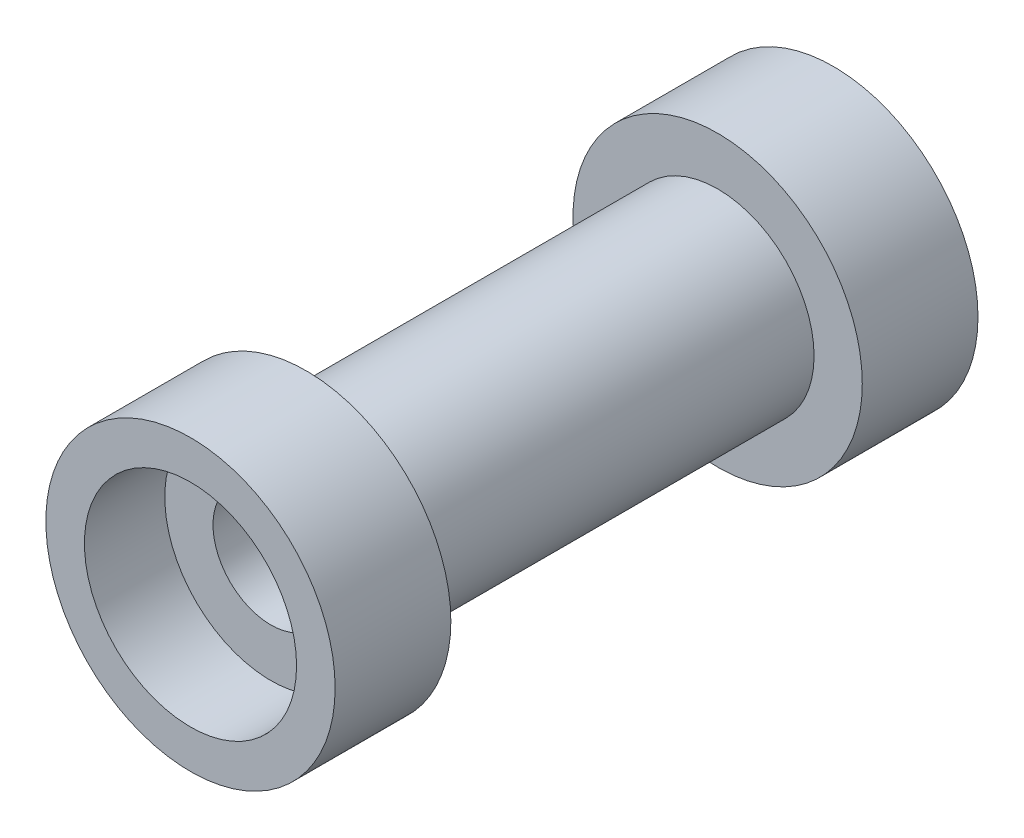
ISO-10303-21;
HEADER;
FILE_DESCRIPTION(('STEP AP214'),'2;1');
FILE_NAME('part.step','',(''),(''),'','','');
FILE_SCHEMA(('AUTOMOTIVE_DESIGN { 1 0 10303 214 1 1 1 1 }'));
ENDSEC;
DATA;
#1=APPLICATION_CONTEXT('core data for automotive mechanical design processes');
#2=APPLICATION_PROTOCOL_DEFINITION('international standard','automotive_design',2000,#1);
#3=PRODUCT_CONTEXT('',#1,'mechanical');
#4=PRODUCT('Part','Part','',(#3));
#5=PRODUCT_RELATED_PRODUCT_CATEGORY('part','',(#4));
#6=PRODUCT_DEFINITION_FORMATION('','',#4);
#7=PRODUCT_DEFINITION_CONTEXT('part definition',#1,'design');
#8=PRODUCT_DEFINITION('design','',#6,#7);
#9=PRODUCT_DEFINITION_SHAPE('','',#8);
#10=(LENGTH_UNIT() NAMED_UNIT(*) SI_UNIT(.MILLI.,.METRE.));
#11=(NAMED_UNIT(*) PLANE_ANGLE_UNIT() SI_UNIT($,.RADIAN.));
#12=(NAMED_UNIT(*) SI_UNIT($,.STERADIAN.) SOLID_ANGLE_UNIT());
#13=UNCERTAINTY_MEASURE_WITH_UNIT(LENGTH_MEASURE(1.E-05),#10,'distance_accuracy_value','');
#14=(GEOMETRIC_REPRESENTATION_CONTEXT(3) GLOBAL_UNCERTAINTY_ASSIGNED_CONTEXT((#13)) GLOBAL_UNIT_ASSIGNED_CONTEXT((#10,
#11,#12)) REPRESENTATION_CONTEXT('',''));
#15=CARTESIAN_POINT('',(0.,0.,0.));
#16=DIRECTION('',(0.,0.,1.));
#17=DIRECTION('',(1.,0.,0.));
#18=AXIS2_PLACEMENT_3D('',#15,#16,#17);
#19=CARTESIAN_POINT('',(-6.,0.,-12.8));
#20=DIRECTION('',(0.,0.,-1.));
#21=DIRECTION('',(-1.,0.,0.));
#22=AXIS2_PLACEMENT_3D('',#19,#20,#21);
#23=PLANE('',#22);
#24=CARTESIAN_POINT('',(0.,0.,-12.8));
#25=DIRECTION('',(0.,0.,1.));
#26=DIRECTION('',(1.,0.,0.));
#27=AXIS2_PLACEMENT_3D('',#24,#25,#26);
#28=CIRCLE('',#27,6.);
#29=CARTESIAN_POINT('',(6.,0.,-12.8));
#30=VERTEX_POINT('',#29);
#31=EDGE_CURVE('E77',#30,#30,#28,.T.);
#32=ORIENTED_EDGE('',*,*,#31,.F.);
#33=EDGE_LOOP('',(#32));
#34=FACE_BOUND('',#33,.T.);
#35=CARTESIAN_POINT('',(0.,0.,-12.8));
#36=DIRECTION('',(0.,0.,1.));
#37=DIRECTION('',(1.,0.,0.));
#38=AXIS2_PLACEMENT_3D('',#35,#36,#37);
#39=CIRCLE('',#38,9.);
#40=CARTESIAN_POINT('',(9.,0.,-12.8));
#41=VERTEX_POINT('',#40);
#42=EDGE_CURVE('E10',#41,#41,#39,.T.);
#43=ORIENTED_EDGE('',*,*,#42,.T.);
#44=EDGE_LOOP('',(#43));
#45=FACE_BOUND('',#44,.T.);
#46=ADVANCED_FACE('F37',(#34,#45),#23,.F.);
#47=CARTESIAN_POINT('',(0.,0.,0.));
#48=DIRECTION('',(0.,0.,1.));
#49=DIRECTION('',(1.,0.,0.));
#50=AXIS2_PLACEMENT_3D('',#47,#48,#49);
#51=CYLINDRICAL_SURFACE('',#50,9.);
#52=ORIENTED_EDGE('',*,*,#42,.F.);
#53=EDGE_LOOP('',(#52));
#54=FACE_BOUND('',#53,.T.);
#55=CARTESIAN_POINT('',(0.,0.,-20.));
#56=DIRECTION('',(0.,0.,1.));
#57=DIRECTION('',(1.,0.,0.));
#58=AXIS2_PLACEMENT_3D('',#55,#56,#57);
#59=CIRCLE('',#58,9.);
#60=CARTESIAN_POINT('',(9.,0.,-20.));
#61=VERTEX_POINT('',#60);
#62=EDGE_CURVE('E43',#61,#61,#59,.T.);
#63=ORIENTED_EDGE('',*,*,#62,.T.);
#64=EDGE_LOOP('',(#63));
#65=FACE_BOUND('',#64,.T.);
#66=ADVANCED_FACE('F84',(#54,#65),#51,.T.);
#67=CARTESIAN_POINT('',(-9.,0.,-20.));
#68=DIRECTION('',(0.,0.,1.));
#69=DIRECTION('',(1.,0.,0.));
#70=AXIS2_PLACEMENT_3D('',#67,#68,#69);
#71=PLANE('',#70);
#72=ORIENTED_EDGE('',*,*,#62,.F.);
#73=EDGE_LOOP('',(#72));
#74=FACE_BOUND('',#73,.T.);
#75=CARTESIAN_POINT('',(0.,0.,-20.));
#76=DIRECTION('',(0.,0.,1.));
#77=DIRECTION('',(1.,0.,0.));
#78=AXIS2_PLACEMENT_3D('',#75,#76,#77);
#79=CIRCLE('',#78,6.6);
#80=CARTESIAN_POINT('',(6.6,0.,-20.));
#81=VERTEX_POINT('',#80);
#82=EDGE_CURVE('E47',#81,#81,#79,.T.);
#83=ORIENTED_EDGE('',*,*,#82,.T.);
#84=EDGE_LOOP('',(#83));
#85=FACE_BOUND('',#84,.T.);
#86=ADVANCED_FACE('F88',(#74,#85),#71,.F.);
#87=CARTESIAN_POINT('',(0.,0.,0.));
#88=DIRECTION('',(0.,0.,1.));
#89=DIRECTION('',(1.,0.,0.));
#90=AXIS2_PLACEMENT_3D('',#87,#88,#89);
#91=CYLINDRICAL_SURFACE('',#90,6.6);
#92=ORIENTED_EDGE('',*,*,#82,.F.);
#93=EDGE_LOOP('',(#92));
#94=FACE_BOUND('',#93,.T.);
#95=CARTESIAN_POINT('',(0.,0.,-15.));
#96=DIRECTION('',(0.,0.,1.));
#97=DIRECTION('',(1.,0.,0.));
#98=AXIS2_PLACEMENT_3D('',#95,#96,#97);
#99=CIRCLE('',#98,6.6);
#100=CARTESIAN_POINT('',(6.6,0.,-15.));
#101=VERTEX_POINT('',#100);
#102=EDGE_CURVE('E51',#101,#101,#99,.T.);
#103=ORIENTED_EDGE('',*,*,#102,.T.);
#104=EDGE_LOOP('',(#103));
#105=FACE_BOUND('',#104,.T.);
#106=ADVANCED_FACE('F93',(#94,#105),#91,.F.);
#107=CARTESIAN_POINT('',(-6.6,0.,-15.));
#108=DIRECTION('',(0.,0.,1.));
#109=DIRECTION('',(1.,0.,0.));
#110=AXIS2_PLACEMENT_3D('',#107,#108,#109);
#111=PLANE('',#110);
#112=ORIENTED_EDGE('',*,*,#102,.F.);
#113=EDGE_LOOP('',(#112));
#114=FACE_BOUND('',#113,.T.);
#115=CARTESIAN_POINT('',(0.,0.,-15.));
#116=DIRECTION('',(0.,0.,1.));
#117=DIRECTION('',(1.,0.,0.));
#118=AXIS2_PLACEMENT_3D('',#115,#116,#117);
#119=CIRCLE('',#118,3.6);
#120=CARTESIAN_POINT('',(3.6,0.,-15.));
#121=VERTEX_POINT('',#120);
#122=EDGE_CURVE('E56',#121,#121,#119,.T.);
#123=ORIENTED_EDGE('',*,*,#122,.T.);
#124=EDGE_LOOP('',(#123));
#125=FACE_BOUND('',#124,.T.);
#126=ADVANCED_FACE('F99',(#114,#125),#111,.F.);
#127=CARTESIAN_POINT('',(0.,0.,0.));
#128=DIRECTION('',(0.,0.,1.));
#129=DIRECTION('',(1.,0.,0.));
#130=AXIS2_PLACEMENT_3D('',#127,#128,#129);
#131=CYLINDRICAL_SURFACE('',#130,3.6);
#132=ORIENTED_EDGE('',*,*,#122,.F.);
#133=EDGE_LOOP('',(#132));
#134=FACE_BOUND('',#133,.T.);
#135=CARTESIAN_POINT('',(0.,0.,15.));
#136=DIRECTION('',(0.,0.,1.));
#137=DIRECTION('',(1.,0.,0.));
#138=AXIS2_PLACEMENT_3D('',#135,#136,#137);
#139=CIRCLE('',#138,3.6);
#140=CARTESIAN_POINT('',(3.6,0.,15.));
#141=VERTEX_POINT('',#140);
#142=EDGE_CURVE('E59',#141,#141,#139,.T.);
#143=ORIENTED_EDGE('',*,*,#142,.T.);
#144=EDGE_LOOP('',(#143));
#145=FACE_BOUND('',#144,.T.);
#146=ADVANCED_FACE('F103',(#134,#145),#131,.F.);
#147=CARTESIAN_POINT('',(-6.6,0.,15.));
#148=DIRECTION('',(0.,0.,-1.));
#149=DIRECTION('',(-1.,0.,0.));
#150=AXIS2_PLACEMENT_3D('',#147,#148,#149);
#151=PLANE('',#150);
#152=ORIENTED_EDGE('',*,*,#142,.F.);
#153=EDGE_LOOP('',(#152));
#154=FACE_BOUND('',#153,.T.);
#155=CARTESIAN_POINT('',(0.,0.,15.));
#156=DIRECTION('',(0.,0.,1.));
#157=DIRECTION('',(1.,0.,0.));
#158=AXIS2_PLACEMENT_3D('',#155,#156,#157);
#159=CIRCLE('',#158,6.6);
#160=CARTESIAN_POINT('',(6.6,0.,15.));
#161=VERTEX_POINT('',#160);
#162=EDGE_CURVE('E62',#161,#161,#159,.T.);
#163=ORIENTED_EDGE('',*,*,#162,.T.);
#164=EDGE_LOOP('',(#163));
#165=FACE_BOUND('',#164,.T.);
#166=ADVANCED_FACE('F107',(#154,#165),#151,.F.);
#167=CARTESIAN_POINT('',(0.,0.,0.));
#168=DIRECTION('',(0.,0.,1.));
#169=DIRECTION('',(1.,0.,0.));
#170=AXIS2_PLACEMENT_3D('',#167,#168,#169);
#171=CYLINDRICAL_SURFACE('',#170,6.59999999999999);
#172=ORIENTED_EDGE('',*,*,#162,.F.);
#173=EDGE_LOOP('',(#172));
#174=FACE_BOUND('',#173,.T.);
#175=CARTESIAN_POINT('',(0.,0.,20.));
#176=DIRECTION('',(0.,0.,1.));
#177=DIRECTION('',(1.,0.,0.));
#178=AXIS2_PLACEMENT_3D('',#175,#176,#177);
#179=CIRCLE('',#178,6.59999999999999);
#180=CARTESIAN_POINT('',(6.59999999999999,0.,20.));
#181=VERTEX_POINT('',#180);
#182=EDGE_CURVE('E65',#181,#181,#179,.T.);
#183=ORIENTED_EDGE('',*,*,#182,.T.);
#184=EDGE_LOOP('',(#183));
#185=FACE_BOUND('',#184,.T.);
#186=ADVANCED_FACE('F111',(#174,#185),#171,.F.);
#187=CARTESIAN_POINT('',(-8.99999999999999,0.,20.));
#188=DIRECTION('',(0.,0.,-1.));
#189=DIRECTION('',(-1.,0.,0.));
#190=AXIS2_PLACEMENT_3D('',#187,#188,#189);
#191=PLANE('',#190);
#192=ORIENTED_EDGE('',*,*,#182,.F.);
#193=EDGE_LOOP('',(#192));
#194=FACE_BOUND('',#193,.T.);
#195=CARTESIAN_POINT('',(0.,0.,20.));
#196=DIRECTION('',(0.,0.,1.));
#197=DIRECTION('',(1.,0.,0.));
#198=AXIS2_PLACEMENT_3D('',#195,#196,#197);
#199=CIRCLE('',#198,8.99999999999999);
#200=CARTESIAN_POINT('',(8.99999999999999,0.,20.));
#201=VERTEX_POINT('',#200);
#202=EDGE_CURVE('E68',#201,#201,#199,.T.);
#203=ORIENTED_EDGE('',*,*,#202,.T.);
#204=EDGE_LOOP('',(#203));
#205=FACE_BOUND('',#204,.T.);
#206=ADVANCED_FACE('F115',(#194,#205),#191,.F.);
#207=CARTESIAN_POINT('',(0.,0.,0.));
#208=DIRECTION('',(0.,0.,1.));
#209=DIRECTION('',(1.,0.,0.));
#210=AXIS2_PLACEMENT_3D('',#207,#208,#209);
#211=CYLINDRICAL_SURFACE('',#210,8.99999999999999);
#212=ORIENTED_EDGE('',*,*,#202,.F.);
#213=EDGE_LOOP('',(#212));
#214=FACE_BOUND('',#213,.T.);
#215=CARTESIAN_POINT('',(0.,0.,12.8));
#216=DIRECTION('',(0.,0.,1.));
#217=DIRECTION('',(1.,0.,0.));
#218=AXIS2_PLACEMENT_3D('',#215,#216,#217);
#219=CIRCLE('',#218,9.);
#220=CARTESIAN_POINT('',(9.,0.,12.8));
#221=VERTEX_POINT('',#220);
#222=EDGE_CURVE('E71',#221,#221,#219,.T.);
#223=ORIENTED_EDGE('',*,*,#222,.T.);
#224=EDGE_LOOP('',(#223));
#225=FACE_BOUND('',#224,.T.);
#226=ADVANCED_FACE('F119',(#214,#225),#211,.T.);
#227=CARTESIAN_POINT('',(-6.,0.,12.8));
#228=DIRECTION('',(0.,0.,1.));
#229=DIRECTION('',(1.,0.,0.));
#230=AXIS2_PLACEMENT_3D('',#227,#228,#229);
#231=PLANE('',#230);
#232=ORIENTED_EDGE('',*,*,#222,.F.);
#233=EDGE_LOOP('',(#232));
#234=FACE_BOUND('',#233,.T.);
#235=CARTESIAN_POINT('',(0.,0.,12.8));
#236=DIRECTION('',(0.,0.,1.));
#237=DIRECTION('',(1.,0.,0.));
#238=AXIS2_PLACEMENT_3D('',#235,#236,#237);
#239=CIRCLE('',#238,6.);
#240=CARTESIAN_POINT('',(6.,0.,12.8));
#241=VERTEX_POINT('',#240);
#242=EDGE_CURVE('E74',#241,#241,#239,.T.);
#243=ORIENTED_EDGE('',*,*,#242,.T.);
#244=EDGE_LOOP('',(#243));
#245=FACE_BOUND('',#244,.T.);
#246=ADVANCED_FACE('F123',(#234,#245),#231,.F.);
#247=CARTESIAN_POINT('',(0.,0.,0.));
#248=DIRECTION('',(0.,0.,1.));
#249=DIRECTION('',(1.,0.,0.));
#250=AXIS2_PLACEMENT_3D('',#247,#248,#249);
#251=CYLINDRICAL_SURFACE('',#250,6.);
#252=ORIENTED_EDGE('',*,*,#242,.F.);
#253=EDGE_LOOP('',(#252));
#254=FACE_BOUND('',#253,.T.);
#255=ORIENTED_EDGE('',*,*,#31,.T.);
#256=EDGE_LOOP('',(#255));
#257=FACE_BOUND('',#256,.T.);
#258=ADVANCED_FACE('F81',(#254,#257),#251,.T.);
#259=CLOSED_SHELL('',(#46,#66,#86,#106,#126,#146,#166,#186,#206,#226,#246,#258));
#260=MANIFOLD_SOLID_BREP('B2',#259);
#261=ADVANCED_BREP_SHAPE_REPRESENTATION('',(#18,#260),#14);
#262=SHAPE_DEFINITION_REPRESENTATION(#9,#261);
ENDSEC;
END-ISO-10303-21;
